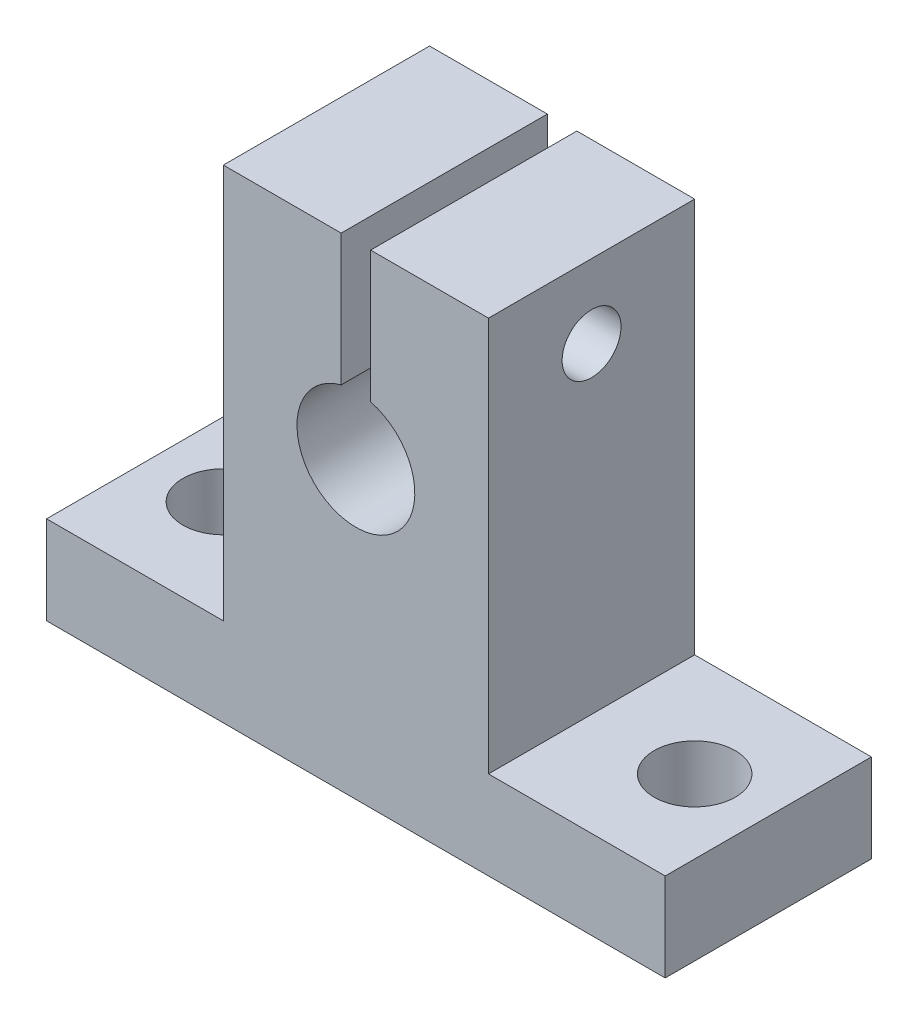
ISO-10303-21;
HEADER;
FILE_DESCRIPTION(('STEP AP214'),'2;1');
FILE_NAME('part.step','',(''),(''),'','','');
FILE_SCHEMA(('AUTOMOTIVE_DESIGN { 1 0 10303 214 1 1 1 1 }'));
ENDSEC;
DATA;
#1=APPLICATION_CONTEXT('core data for automotive mechanical design processes');
#2=APPLICATION_PROTOCOL_DEFINITION('international standard','automotive_design',2000,#1);
#3=PRODUCT_CONTEXT('',#1,'mechanical');
#4=PRODUCT('Part','Part','',(#3));
#5=PRODUCT_RELATED_PRODUCT_CATEGORY('part','',(#4));
#6=PRODUCT_DEFINITION_FORMATION('','',#4);
#7=PRODUCT_DEFINITION_CONTEXT('part definition',#1,'design');
#8=PRODUCT_DEFINITION('design','',#6,#7);
#9=PRODUCT_DEFINITION_SHAPE('','',#8);
#10=(LENGTH_UNIT() NAMED_UNIT(*) SI_UNIT(.MILLI.,.METRE.));
#11=(NAMED_UNIT(*) PLANE_ANGLE_UNIT() SI_UNIT($,.RADIAN.));
#12=(NAMED_UNIT(*) SI_UNIT($,.STERADIAN.) SOLID_ANGLE_UNIT());
#13=UNCERTAINTY_MEASURE_WITH_UNIT(LENGTH_MEASURE(1.E-05),#10,'distance_accuracy_value','');
#14=(GEOMETRIC_REPRESENTATION_CONTEXT(3) GLOBAL_UNCERTAINTY_ASSIGNED_CONTEXT((#13)) GLOBAL_UNIT_ASSIGNED_CONTEXT((#10,
#11,#12)) REPRESENTATION_CONTEXT('',''));
#15=CARTESIAN_POINT('',(0.,0.,0.));
#16=DIRECTION('',(0.,0.,1.));
#17=DIRECTION('',(1.,0.,0.));
#18=AXIS2_PLACEMENT_3D('',#15,#16,#17);
#19=CARTESIAN_POINT('',(14.6568542494924,27.8,7.));
#20=DIRECTION('',(-1.,0.,0.));
#21=DIRECTION('',(0.,0.,1.));
#22=AXIS2_PLACEMENT_3D('',#19,#20,#21);
#23=CYLINDRICAL_SURFACE('',#22,2.);
#24=CARTESIAN_POINT('',(-0.999999999999999,27.8,7.));
#25=DIRECTION('',(-1.,0.,0.));
#26=DIRECTION('',(0.,0.,1.));
#27=AXIS2_PLACEMENT_3D('',#24,#25,#26);
#28=CIRCLE('',#27,2.);
#29=CARTESIAN_POINT('',(-0.999999999999999,27.8,9.));
#30=VERTEX_POINT('',#29);
#31=EDGE_CURVE('E180',#30,#30,#28,.T.);
#32=ORIENTED_EDGE('',*,*,#31,.F.);
#33=EDGE_LOOP('',(#32));
#34=FACE_BOUND('',#33,.T.);
#35=CARTESIAN_POINT('',(-5.,27.8,7.));
#36=DIRECTION('',(-1.,0.,0.));
#37=DIRECTION('',(0.,0.,1.));
#38=AXIS2_PLACEMENT_3D('',#35,#36,#37);
#39=CIRCLE('',#38,2.);
#40=CARTESIAN_POINT('',(-5.,27.8,9.));
#41=VERTEX_POINT('',#40);
#42=EDGE_CURVE('E37',#41,#41,#39,.F.);
#43=ORIENTED_EDGE('',*,*,#42,.F.);
#44=EDGE_LOOP('',(#43));
#45=FACE_BOUND('',#44,.T.);
#46=ADVANCED_FACE('F33',(#34,#45),#23,.F.);
#47=CARTESIAN_POINT('',(-9.,32.8,14.));
#48=DIRECTION('',(0.,-1.,0.));
#49=DIRECTION('',(0.,0.,-1.));
#50=AXIS2_PLACEMENT_3D('',#47,#48,#49);
#51=PLANE('',#50);
#52=DIRECTION('',(0.,0.,-1.));
#53=VECTOR('',#52,1.);
#54=CARTESIAN_POINT('',(0.999999999999999,32.8,14.));
#55=LINE('',#54,#53);
#56=CARTESIAN_POINT('',(0.999999999999999,32.8,14.));
#57=VERTEX_POINT('',#56);
#58=CARTESIAN_POINT('',(0.999999999999999,32.8,0.));
#59=VERTEX_POINT('',#58);
#60=EDGE_CURVE('E215',#57,#59,#55,.T.);
#61=ORIENTED_EDGE('',*,*,#60,.F.);
#62=DIRECTION('',(-1.,0.,0.));
#63=VECTOR('',#62,1.);
#64=CARTESIAN_POINT('',(-9.,32.8,14.));
#65=LINE('',#64,#63);
#66=CARTESIAN_POINT('',(9.,32.8,14.));
#67=VERTEX_POINT('',#66);
#68=EDGE_CURVE('E130',#67,#57,#65,.T.);
#69=ORIENTED_EDGE('',*,*,#68,.F.);
#70=DIRECTION('',(0.,0.,-1.));
#71=VECTOR('',#70,1.);
#72=CARTESIAN_POINT('',(9.,32.8,14.));
#73=LINE('',#72,#71);
#74=CARTESIAN_POINT('',(9.,32.8,0.));
#75=VERTEX_POINT('',#74);
#76=EDGE_CURVE('E140',#67,#75,#73,.T.);
#77=ORIENTED_EDGE('',*,*,#76,.T.);
#78=DIRECTION('',(-1.,0.,0.));
#79=VECTOR('',#78,1.);
#80=CARTESIAN_POINT('',(-9.,32.8,0.));
#81=LINE('',#80,#79);
#82=EDGE_CURVE('E162',#75,#59,#81,.T.);
#83=ORIENTED_EDGE('',*,*,#82,.T.);
#84=EDGE_LOOP('',(#61,#69,#77,#83));
#85=FACE_BOUND('',#84,.T.);
#86=ADVANCED_FACE('F248',(#85),#51,.F.);
#87=CARTESIAN_POINT('',(0.,0.,14.));
#88=DIRECTION('',(0.,0.,-1.));
#89=DIRECTION('',(-1.,0.,0.));
#90=AXIS2_PLACEMENT_3D('',#87,#88,#89);
#91=PLANE('',#90);
#92=DIRECTION('',(0.,1.,0.));
#93=VECTOR('',#92,1.);
#94=CARTESIAN_POINT('',(0.999999999999999,23.8729833462074,14.));
#95=LINE('',#94,#93);
#96=CARTESIAN_POINT('',(0.999999999999999,23.8729833462074,14.));
#97=VERTEX_POINT('',#96);
#98=EDGE_CURVE('E218',#97,#57,#95,.T.);
#99=ORIENTED_EDGE('',*,*,#98,.F.);
#100=CARTESIAN_POINT('',(0.,20.,14.));
#101=DIRECTION('',(0.,0.,-1.));
#102=DIRECTION('',(-1.,0.,0.));
#103=AXIS2_PLACEMENT_3D('',#100,#101,#102);
#104=CIRCLE('',#103,4.);
#105=CARTESIAN_POINT('',(-0.999999999999999,23.8729833462074,14.));
#106=VERTEX_POINT('',#105);
#107=EDGE_CURVE('E211',#97,#106,#104,.T.);
#108=ORIENTED_EDGE('',*,*,#107,.T.);
#109=DIRECTION('',(0.,1.,0.));
#110=VECTOR('',#109,1.);
#111=CARTESIAN_POINT('',(-0.999999999999999,23.8729833462074,14.));
#112=LINE('',#111,#110);
#113=CARTESIAN_POINT('',(-0.999999999999999,32.8,14.));
#114=VERTEX_POINT('',#113);
#115=EDGE_CURVE('E127',#106,#114,#112,.T.);
#116=ORIENTED_EDGE('',*,*,#115,.T.);
#117=CARTESIAN_POINT('',(-9.,32.8,14.));
#118=VERTEX_POINT('',#117);
#119=EDGE_CURVE('E117',#114,#118,#65,.T.);
#120=ORIENTED_EDGE('',*,*,#119,.T.);
#121=DIRECTION('',(0.,-1.,0.));
#122=VECTOR('',#121,1.);
#123=CARTESIAN_POINT('',(-9.,6.,14.));
#124=LINE('',#123,#122);
#125=CARTESIAN_POINT('',(-9.,6.,14.));
#126=VERTEX_POINT('',#125);
#127=EDGE_CURVE('E122',#118,#126,#124,.T.);
#128=ORIENTED_EDGE('',*,*,#127,.T.);
#129=DIRECTION('',(-1.,0.,0.));
#130=VECTOR('',#129,1.);
#131=CARTESIAN_POINT('',(-21.,6.,14.));
#132=LINE('',#131,#130);
#133=CARTESIAN_POINT('',(-21.,6.,14.));
#134=VERTEX_POINT('',#133);
#135=EDGE_CURVE('E59',#126,#134,#132,.T.);
#136=ORIENTED_EDGE('',*,*,#135,.T.);
#137=DIRECTION('',(0.,-1.,0.));
#138=VECTOR('',#137,1.);
#139=CARTESIAN_POINT('',(-21.,0.,14.));
#140=LINE('',#139,#138);
#141=CARTESIAN_POINT('',(-21.,0.,14.));
#142=VERTEX_POINT('',#141);
#143=EDGE_CURVE('E168',#134,#142,#140,.T.);
#144=ORIENTED_EDGE('',*,*,#143,.T.);
#145=DIRECTION('',(1.,0.,0.));
#146=VECTOR('',#145,1.);
#147=CARTESIAN_POINT('',(21.,0.,14.));
#148=LINE('',#147,#146);
#149=CARTESIAN_POINT('',(21.,0.,14.));
#150=VERTEX_POINT('',#149);
#151=EDGE_CURVE('E100',#142,#150,#148,.T.);
#152=ORIENTED_EDGE('',*,*,#151,.T.);
#153=DIRECTION('',(0.,1.,0.));
#154=VECTOR('',#153,1.);
#155=CARTESIAN_POINT('',(21.,0.,14.));
#156=LINE('',#155,#154);
#157=CARTESIAN_POINT('',(21.,6.,14.));
#158=VERTEX_POINT('',#157);
#159=EDGE_CURVE('E233',#150,#158,#156,.T.);
#160=ORIENTED_EDGE('',*,*,#159,.T.);
#161=DIRECTION('',(-1.,0.,0.));
#162=VECTOR('',#161,1.);
#163=CARTESIAN_POINT('',(21.,6.,14.));
#164=LINE('',#163,#162);
#165=CARTESIAN_POINT('',(9.,6.,14.));
#166=VERTEX_POINT('',#165);
#167=EDGE_CURVE('E235',#158,#166,#164,.T.);
#168=ORIENTED_EDGE('',*,*,#167,.T.);
#169=DIRECTION('',(0.,1.,0.));
#170=VECTOR('',#169,1.);
#171=CARTESIAN_POINT('',(9.,6.,14.));
#172=LINE('',#171,#170);
#173=EDGE_CURVE('E131',#166,#67,#172,.T.);
#174=ORIENTED_EDGE('',*,*,#173,.T.);
#175=ORIENTED_EDGE('',*,*,#68,.T.);
#176=EDGE_LOOP('',(#99,#108,#116,#120,#128,#136,#144,#152,#160,#168,#174,#175));
#177=FACE_BOUND('',#176,.T.);
#178=ADVANCED_FACE('F120',(#177),#91,.F.);
#179=CARTESIAN_POINT('',(0.,0.,0.));
#180=DIRECTION('',(0.,0.,-1.));
#181=DIRECTION('',(-1.,0.,0.));
#182=AXIS2_PLACEMENT_3D('',#179,#180,#181);
#183=PLANE('',#182);
#184=CARTESIAN_POINT('',(0.,20.,0.));
#185=DIRECTION('',(0.,0.,-1.));
#186=DIRECTION('',(-1.,0.,0.));
#187=AXIS2_PLACEMENT_3D('',#184,#185,#186);
#188=CIRCLE('',#187,4.);
#189=CARTESIAN_POINT('',(0.999999999999999,23.8729833462074,0.));
#190=VERTEX_POINT('',#189);
#191=CARTESIAN_POINT('',(-0.999999999999999,23.8729833462074,0.));
#192=VERTEX_POINT('',#191);
#193=EDGE_CURVE('E50',#190,#192,#188,.T.);
#194=ORIENTED_EDGE('',*,*,#193,.F.);
#195=DIRECTION('',(0.,1.,0.));
#196=VECTOR('',#195,1.);
#197=CARTESIAN_POINT('',(0.999999999999999,23.8729833462074,0.));
#198=LINE('',#197,#196);
#199=EDGE_CURVE('E206',#190,#59,#198,.T.);
#200=ORIENTED_EDGE('',*,*,#199,.T.);
#201=ORIENTED_EDGE('',*,*,#82,.F.);
#202=DIRECTION('',(0.,1.,0.));
#203=VECTOR('',#202,1.);
#204=CARTESIAN_POINT('',(9.,6.,0.));
#205=LINE('',#204,#203);
#206=CARTESIAN_POINT('',(9.,6.,0.));
#207=VERTEX_POINT('',#206);
#208=EDGE_CURVE('E160',#207,#75,#205,.T.);
#209=ORIENTED_EDGE('',*,*,#208,.F.);
#210=DIRECTION('',(-1.,0.,0.));
#211=VECTOR('',#210,1.);
#212=CARTESIAN_POINT('',(21.,6.,0.));
#213=LINE('',#212,#211);
#214=CARTESIAN_POINT('',(21.,6.,0.));
#215=VERTEX_POINT('',#214);
#216=EDGE_CURVE('E158',#215,#207,#213,.T.);
#217=ORIENTED_EDGE('',*,*,#216,.F.);
#218=DIRECTION('',(0.,1.,0.));
#219=VECTOR('',#218,1.);
#220=CARTESIAN_POINT('',(21.,0.,0.));
#221=LINE('',#220,#219);
#222=CARTESIAN_POINT('',(21.,0.,0.));
#223=VERTEX_POINT('',#222);
#224=EDGE_CURVE('E156',#223,#215,#221,.T.);
#225=ORIENTED_EDGE('',*,*,#224,.F.);
#226=DIRECTION('',(1.,0.,0.));
#227=VECTOR('',#226,1.);
#228=CARTESIAN_POINT('',(21.,0.,0.));
#229=LINE('',#228,#227);
#230=CARTESIAN_POINT('',(-21.,0.,0.));
#231=VERTEX_POINT('',#230);
#232=EDGE_CURVE('E153',#231,#223,#229,.T.);
#233=ORIENTED_EDGE('',*,*,#232,.F.);
#234=DIRECTION('',(0.,-1.,0.));
#235=VECTOR('',#234,1.);
#236=CARTESIAN_POINT('',(-21.,0.,0.));
#237=LINE('',#236,#235);
#238=CARTESIAN_POINT('',(-21.,6.,0.));
#239=VERTEX_POINT('',#238);
#240=EDGE_CURVE('E150',#239,#231,#237,.T.);
#241=ORIENTED_EDGE('',*,*,#240,.F.);
#242=DIRECTION('',(-1.,0.,0.));
#243=VECTOR('',#242,1.);
#244=CARTESIAN_POINT('',(-21.,6.,0.));
#245=LINE('',#244,#243);
#246=CARTESIAN_POINT('',(-9.,6.,0.));
#247=VERTEX_POINT('',#246);
#248=EDGE_CURVE('E92',#247,#239,#245,.T.);
#249=ORIENTED_EDGE('',*,*,#248,.F.);
#250=DIRECTION('',(0.,-1.,0.));
#251=VECTOR('',#250,1.);
#252=CARTESIAN_POINT('',(-9.,6.,0.));
#253=LINE('',#252,#251);
#254=CARTESIAN_POINT('',(-9.,32.8,0.));
#255=VERTEX_POINT('',#254);
#256=EDGE_CURVE('E165',#255,#247,#253,.T.);
#257=ORIENTED_EDGE('',*,*,#256,.F.);
#258=CARTESIAN_POINT('',(-0.999999999999999,32.8,0.));
#259=VERTEX_POINT('',#258);
#260=EDGE_CURVE('E137',#259,#255,#81,.T.);
#261=ORIENTED_EDGE('',*,*,#260,.F.);
#262=DIRECTION('',(0.,1.,0.));
#263=VECTOR('',#262,1.);
#264=CARTESIAN_POINT('',(-0.999999999999999,23.8729833462074,0.));
#265=LINE('',#264,#263);
#266=EDGE_CURVE('E221',#192,#259,#265,.T.);
#267=ORIENTED_EDGE('',*,*,#266,.F.);
#268=EDGE_LOOP('',(#194,#200,#201,#209,#217,#225,#233,#241,#249,#257,#261,#267));
#269=FACE_BOUND('',#268,.T.);
#270=ADVANCED_FACE('F257',(#269),#183,.T.);
#271=CARTESIAN_POINT('',(-21.,0.,14.));
#272=DIRECTION('',(1.,0.,0.));
#273=DIRECTION('',(0.,0.,-1.));
#274=AXIS2_PLACEMENT_3D('',#271,#272,#273);
#275=PLANE('',#274);
#276=ORIENTED_EDGE('',*,*,#240,.T.);
#277=DIRECTION('',(0.,0.,-1.));
#278=VECTOR('',#277,1.);
#279=CARTESIAN_POINT('',(-21.,0.,14.));
#280=LINE('',#279,#278);
#281=EDGE_CURVE('E11',#142,#231,#280,.T.);
#282=ORIENTED_EDGE('',*,*,#281,.F.);
#283=ORIENTED_EDGE('',*,*,#143,.F.);
#284=DIRECTION('',(0.,0.,-1.));
#285=VECTOR('',#284,1.);
#286=CARTESIAN_POINT('',(-21.,6.,14.));
#287=LINE('',#286,#285);
#288=EDGE_CURVE('E145',#134,#239,#287,.T.);
#289=ORIENTED_EDGE('',*,*,#288,.T.);
#290=EDGE_LOOP('',(#276,#282,#283,#289));
#291=FACE_BOUND('',#290,.T.);
#292=ADVANCED_FACE('F35',(#291),#275,.F.);
#293=CARTESIAN_POINT('',(21.,0.,14.));
#294=DIRECTION('',(0.,1.,0.));
#295=DIRECTION('',(0.,0.,1.));
#296=AXIS2_PLACEMENT_3D('',#293,#294,#295);
#297=PLANE('',#296);
#298=CARTESIAN_POINT('',(16.,0.,7.));
#299=DIRECTION('',(0.,-1.,0.));
#300=DIRECTION('',(0.,0.,-1.));
#301=AXIS2_PLACEMENT_3D('',#298,#299,#300);
#302=CIRCLE('',#301,2.75);
#303=CARTESIAN_POINT('',(16.,0.,4.25));
#304=VERTEX_POINT('',#303);
#305=EDGE_CURVE('E199',#304,#304,#302,.T.);
#306=ORIENTED_EDGE('',*,*,#305,.F.);
#307=EDGE_LOOP('',(#306));
#308=FACE_BOUND('',#307,.T.);
#309=CARTESIAN_POINT('',(-16.,0.,6.99999999999998));
#310=DIRECTION('',(0.,-1.,0.));
#311=DIRECTION('',(0.,0.,1.));
#312=AXIS2_PLACEMENT_3D('',#309,#310,#311);
#313=CIRCLE('',#312,2.75);
#314=CARTESIAN_POINT('',(-16.,0.,9.74999999999998));
#315=VERTEX_POINT('',#314);
#316=EDGE_CURVE('E187',#315,#315,#313,.T.);
#317=ORIENTED_EDGE('',*,*,#316,.F.);
#318=EDGE_LOOP('',(#317));
#319=FACE_BOUND('',#318,.T.);
#320=ORIENTED_EDGE('',*,*,#232,.T.);
#321=DIRECTION('',(0.,0.,-1.));
#322=VECTOR('',#321,1.);
#323=CARTESIAN_POINT('',(21.,0.,14.));
#324=LINE('',#323,#322);
#325=EDGE_CURVE('E42',#150,#223,#324,.T.);
#326=ORIENTED_EDGE('',*,*,#325,.F.);
#327=ORIENTED_EDGE('',*,*,#151,.F.);
#328=ORIENTED_EDGE('',*,*,#281,.T.);
#329=EDGE_LOOP('',(#320,#326,#327,#328));
#330=FACE_BOUND('',#329,.T.);
#331=ADVANCED_FACE('F276',(#308,#319,#330),#297,.F.);
#332=CARTESIAN_POINT('',(21.,0.,14.));
#333=DIRECTION('',(-1.,0.,0.));
#334=DIRECTION('',(0.,0.,1.));
#335=AXIS2_PLACEMENT_3D('',#332,#333,#334);
#336=PLANE('',#335);
#337=ORIENTED_EDGE('',*,*,#224,.T.);
#338=DIRECTION('',(0.,0.,-1.));
#339=VECTOR('',#338,1.);
#340=CARTESIAN_POINT('',(21.,6.,14.));
#341=LINE('',#340,#339);
#342=EDGE_CURVE('E176',#158,#215,#341,.T.);
#343=ORIENTED_EDGE('',*,*,#342,.F.);
#344=ORIENTED_EDGE('',*,*,#159,.F.);
#345=ORIENTED_EDGE('',*,*,#325,.T.);
#346=EDGE_LOOP('',(#337,#343,#344,#345));
#347=FACE_BOUND('',#346,.T.);
#348=ADVANCED_FACE('F279',(#347),#336,.F.);
#349=CARTESIAN_POINT('',(21.,6.,14.));
#350=DIRECTION('',(0.,-1.,0.));
#351=DIRECTION('',(0.,0.,-1.));
#352=AXIS2_PLACEMENT_3D('',#349,#350,#351);
#353=PLANE('',#352);
#354=CARTESIAN_POINT('',(16.,6.,7.));
#355=DIRECTION('',(0.,-1.,0.));
#356=DIRECTION('',(0.,0.,-1.));
#357=AXIS2_PLACEMENT_3D('',#354,#355,#356);
#358=CIRCLE('',#357,2.75);
#359=CARTESIAN_POINT('',(16.,6.,4.25));
#360=VERTEX_POINT('',#359);
#361=EDGE_CURVE('E202',#360,#360,#358,.F.);
#362=ORIENTED_EDGE('',*,*,#361,.F.);
#363=EDGE_LOOP('',(#362));
#364=FACE_BOUND('',#363,.T.);
#365=ORIENTED_EDGE('',*,*,#216,.T.);
#366=DIRECTION('',(0.,0.,-1.));
#367=VECTOR('',#366,1.);
#368=CARTESIAN_POINT('',(9.,6.,14.));
#369=LINE('',#368,#367);
#370=EDGE_CURVE('E173',#166,#207,#369,.T.);
#371=ORIENTED_EDGE('',*,*,#370,.F.);
#372=ORIENTED_EDGE('',*,*,#167,.F.);
#373=ORIENTED_EDGE('',*,*,#342,.T.);
#374=EDGE_LOOP('',(#365,#371,#372,#373));
#375=FACE_BOUND('',#374,.T.);
#376=ADVANCED_FACE('F282',(#364,#375),#353,.F.);
#377=CARTESIAN_POINT('',(9.,6.,14.));
#378=DIRECTION('',(-1.,0.,0.));
#379=DIRECTION('',(0.,0.,1.));
#380=AXIS2_PLACEMENT_3D('',#377,#378,#379);
#381=PLANE('',#380);
#382=CARTESIAN_POINT('',(9.,27.8,7.));
#383=DIRECTION('',(-1.,0.,0.));
#384=DIRECTION('',(0.,0.,1.));
#385=AXIS2_PLACEMENT_3D('',#382,#383,#384);
#386=CIRCLE('',#385,2.);
#387=CARTESIAN_POINT('',(9.,27.8,9.));
#388=VERTEX_POINT('',#387);
#389=EDGE_CURVE('E183',#388,#388,#386,.F.);
#390=ORIENTED_EDGE('',*,*,#389,.F.);
#391=EDGE_LOOP('',(#390));
#392=FACE_BOUND('',#391,.T.);
#393=ORIENTED_EDGE('',*,*,#208,.T.);
#394=ORIENTED_EDGE('',*,*,#76,.F.);
#395=ORIENTED_EDGE('',*,*,#173,.F.);
#396=ORIENTED_EDGE('',*,*,#370,.T.);
#397=EDGE_LOOP('',(#393,#394,#395,#396));
#398=FACE_BOUND('',#397,.T.);
#399=ADVANCED_FACE('F243',(#392,#398),#381,.F.);
#400=ORIENTED_EDGE('',*,*,#119,.F.);
#401=DIRECTION('',(0.,0.,-1.));
#402=VECTOR('',#401,1.);
#403=CARTESIAN_POINT('',(-0.999999999999999,32.8,14.));
#404=LINE('',#403,#402);
#405=EDGE_CURVE('E223',#114,#259,#404,.T.);
#406=ORIENTED_EDGE('',*,*,#405,.T.);
#407=ORIENTED_EDGE('',*,*,#260,.T.);
#408=DIRECTION('',(0.,0.,-1.));
#409=VECTOR('',#408,1.);
#410=CARTESIAN_POINT('',(-9.,32.8,14.));
#411=LINE('',#410,#409);
#412=EDGE_CURVE('E134',#118,#255,#411,.T.);
#413=ORIENTED_EDGE('',*,*,#412,.F.);
#414=EDGE_LOOP('',(#400,#406,#407,#413));
#415=FACE_BOUND('',#414,.T.);
#416=ADVANCED_FACE('F135',(#415),#51,.F.);
#417=CARTESIAN_POINT('',(-9.,6.,14.));
#418=DIRECTION('',(1.,0.,0.));
#419=DIRECTION('',(0.,0.,-1.));
#420=AXIS2_PLACEMENT_3D('',#417,#418,#419);
#421=PLANE('',#420);
#422=CARTESIAN_POINT('',(-9.,27.8,7.));
#423=DIRECTION('',(-1.,0.,0.));
#424=DIRECTION('',(0.,0.,1.));
#425=AXIS2_PLACEMENT_3D('',#422,#423,#424);
#426=CIRCLE('',#425,3.5);
#427=CARTESIAN_POINT('',(-9.,27.8,10.5));
#428=VERTEX_POINT('',#427);
#429=EDGE_CURVE('E196',#428,#428,#426,.T.);
#430=ORIENTED_EDGE('',*,*,#429,.F.);
#431=EDGE_LOOP('',(#430));
#432=FACE_BOUND('',#431,.T.);
#433=ORIENTED_EDGE('',*,*,#256,.T.);
#434=DIRECTION('',(0.,0.,-1.));
#435=VECTOR('',#434,1.);
#436=CARTESIAN_POINT('',(-9.,6.,14.));
#437=LINE('',#436,#435);
#438=EDGE_CURVE('E141',#126,#247,#437,.T.);
#439=ORIENTED_EDGE('',*,*,#438,.F.);
#440=ORIENTED_EDGE('',*,*,#127,.F.);
#441=ORIENTED_EDGE('',*,*,#412,.T.);
#442=EDGE_LOOP('',(#433,#439,#440,#441));
#443=FACE_BOUND('',#442,.T.);
#444=ADVANCED_FACE('F143',(#432,#443),#421,.F.);
#445=CARTESIAN_POINT('',(-21.,6.,14.));
#446=DIRECTION('',(0.,-1.,0.));
#447=DIRECTION('',(0.,0.,-1.));
#448=AXIS2_PLACEMENT_3D('',#445,#446,#447);
#449=PLANE('',#448);
#450=CARTESIAN_POINT('',(-16.,6.,6.99999999999998));
#451=DIRECTION('',(0.,-1.,0.));
#452=DIRECTION('',(0.,0.,-1.));
#453=AXIS2_PLACEMENT_3D('',#450,#451,#452);
#454=CIRCLE('',#453,2.75);
#455=CARTESIAN_POINT('',(-16.,6.,4.24999999999999));
#456=VERTEX_POINT('',#455);
#457=EDGE_CURVE('E203',#456,#456,#454,.F.);
#458=ORIENTED_EDGE('',*,*,#457,.F.);
#459=EDGE_LOOP('',(#458));
#460=FACE_BOUND('',#459,.T.);
#461=ORIENTED_EDGE('',*,*,#248,.T.);
#462=ORIENTED_EDGE('',*,*,#288,.F.);
#463=ORIENTED_EDGE('',*,*,#135,.F.);
#464=ORIENTED_EDGE('',*,*,#438,.T.);
#465=EDGE_LOOP('',(#461,#462,#463,#464));
#466=FACE_BOUND('',#465,.T.);
#467=ADVANCED_FACE('F270',(#460,#466),#449,.F.);
#468=CARTESIAN_POINT('',(0.,20.,14.));
#469=DIRECTION('',(0.,0.,-1.));
#470=DIRECTION('',(-1.,0.,0.));
#471=AXIS2_PLACEMENT_3D('',#468,#469,#470);
#472=CYLINDRICAL_SURFACE('',#471,4.);
#473=ORIENTED_EDGE('',*,*,#193,.T.);
#474=DIRECTION('',(0.,0.,-1.));
#475=VECTOR('',#474,1.);
#476=CARTESIAN_POINT('',(-0.999999999999999,23.8729833462074,14.));
#477=LINE('',#476,#475);
#478=EDGE_CURVE('E213',#106,#192,#477,.T.);
#479=ORIENTED_EDGE('',*,*,#478,.F.);
#480=ORIENTED_EDGE('',*,*,#107,.F.);
#481=DIRECTION('',(0.,0.,-1.));
#482=VECTOR('',#481,1.);
#483=CARTESIAN_POINT('',(0.999999999999999,23.8729833462074,14.));
#484=LINE('',#483,#482);
#485=EDGE_CURVE('E154',#97,#190,#484,.T.);
#486=ORIENTED_EDGE('',*,*,#485,.T.);
#487=EDGE_LOOP('',(#473,#479,#480,#486));
#488=FACE_BOUND('',#487,.T.);
#489=ADVANCED_FACE('F266',(#488),#472,.F.);
#490=CARTESIAN_POINT('',(0.999999999999999,23.8729833462074,14.));
#491=DIRECTION('',(-1.,0.,0.));
#492=DIRECTION('',(0.,0.,1.));
#493=AXIS2_PLACEMENT_3D('',#490,#491,#492);
#494=PLANE('',#493);
#495=CARTESIAN_POINT('',(0.999999999999999,27.8,7.));
#496=DIRECTION('',(-1.,0.,0.));
#497=DIRECTION('',(0.,0.,1.));
#498=AXIS2_PLACEMENT_3D('',#495,#496,#497);
#499=CIRCLE('',#498,2.);
#500=CARTESIAN_POINT('',(0.999999999999999,27.8,9.));
#501=VERTEX_POINT('',#500);
#502=EDGE_CURVE('E182',#501,#501,#499,.T.);
#503=ORIENTED_EDGE('',*,*,#502,.F.);
#504=EDGE_LOOP('',(#503));
#505=FACE_BOUND('',#504,.T.);
#506=ORIENTED_EDGE('',*,*,#199,.F.);
#507=ORIENTED_EDGE('',*,*,#485,.F.);
#508=ORIENTED_EDGE('',*,*,#98,.T.);
#509=ORIENTED_EDGE('',*,*,#60,.T.);
#510=EDGE_LOOP('',(#506,#507,#508,#509));
#511=FACE_BOUND('',#510,.T.);
#512=ADVANCED_FACE('F253',(#505,#511),#494,.T.);
#513=CARTESIAN_POINT('',(-0.999999999999999,23.8729833462074,14.));
#514=DIRECTION('',(-1.,0.,0.));
#515=DIRECTION('',(0.,0.,1.));
#516=AXIS2_PLACEMENT_3D('',#513,#514,#515);
#517=PLANE('',#516);
#518=ORIENTED_EDGE('',*,*,#31,.T.);
#519=EDGE_LOOP('',(#518));
#520=FACE_BOUND('',#519,.T.);
#521=ORIENTED_EDGE('',*,*,#266,.T.);
#522=ORIENTED_EDGE('',*,*,#405,.F.);
#523=ORIENTED_EDGE('',*,*,#115,.F.);
#524=ORIENTED_EDGE('',*,*,#478,.T.);
#525=EDGE_LOOP('',(#521,#522,#523,#524));
#526=FACE_BOUND('',#525,.T.);
#527=ADVANCED_FACE('F268',(#520,#526),#517,.F.);
#528=CARTESIAN_POINT('',(-16.,32.801,6.99999999999998));
#529=DIRECTION('',(0.,-1.,0.));
#530=DIRECTION('',(0.,0.,-1.));
#531=AXIS2_PLACEMENT_3D('',#528,#529,#530);
#532=CYLINDRICAL_SURFACE('',#531,2.75);
#533=ORIENTED_EDGE('',*,*,#316,.T.);
#534=EDGE_LOOP('',(#533));
#535=FACE_BOUND('',#534,.T.);
#536=ORIENTED_EDGE('',*,*,#457,.T.);
#537=EDGE_LOOP('',(#536));
#538=FACE_BOUND('',#537,.T.);
#539=ADVANCED_FACE('F316',(#535,#538),#532,.F.);
#540=CARTESIAN_POINT('',(16.,32.801,7.));
#541=DIRECTION('',(0.,-1.,0.));
#542=DIRECTION('',(0.,0.,-1.));
#543=AXIS2_PLACEMENT_3D('',#540,#541,#542);
#544=CYLINDRICAL_SURFACE('',#543,2.75);
#545=ORIENTED_EDGE('',*,*,#305,.T.);
#546=EDGE_LOOP('',(#545));
#547=FACE_BOUND('',#546,.T.);
#548=ORIENTED_EDGE('',*,*,#361,.T.);
#549=EDGE_LOOP('',(#548));
#550=FACE_BOUND('',#549,.T.);
#551=ADVANCED_FACE('F307',(#547,#550),#544,.F.);
#552=ORIENTED_EDGE('',*,*,#502,.T.);
#553=EDGE_LOOP('',(#552));
#554=FACE_BOUND('',#553,.T.);
#555=ORIENTED_EDGE('',*,*,#389,.T.);
#556=EDGE_LOOP('',(#555));
#557=FACE_BOUND('',#556,.T.);
#558=ADVANCED_FACE('F297',(#554,#557),#23,.F.);
#559=CARTESIAN_POINT('',(-5.,27.8,7.));
#560=DIRECTION('',(-1.,0.,0.));
#561=DIRECTION('',(0.,0.,1.));
#562=AXIS2_PLACEMENT_3D('',#559,#560,#561);
#563=PLANE('',#562);
#564=CARTESIAN_POINT('',(-5.,27.8,7.));
#565=DIRECTION('',(-1.,0.,0.));
#566=DIRECTION('',(0.,0.,1.));
#567=AXIS2_PLACEMENT_3D('',#564,#565,#566);
#568=CIRCLE('',#567,3.5);
#569=CARTESIAN_POINT('',(-5.,27.8,10.5));
#570=VERTEX_POINT('',#569);
#571=EDGE_CURVE('E194',#570,#570,#568,.T.);
#572=ORIENTED_EDGE('',*,*,#571,.T.);
#573=EDGE_LOOP('',(#572));
#574=FACE_BOUND('',#573,.T.);
#575=ORIENTED_EDGE('',*,*,#42,.T.);
#576=EDGE_LOOP('',(#575));
#577=FACE_BOUND('',#576,.T.);
#578=ADVANCED_FACE('F306',(#574,#577),#563,.T.);
#579=CARTESIAN_POINT('',(-5.,27.8,7.));
#580=DIRECTION('',(-1.,0.,0.));
#581=DIRECTION('',(0.,0.,1.));
#582=AXIS2_PLACEMENT_3D('',#579,#580,#581);
#583=CYLINDRICAL_SURFACE('',#582,3.5);
#584=ORIENTED_EDGE('',*,*,#571,.F.);
#585=EDGE_LOOP('',(#584));
#586=FACE_BOUND('',#585,.T.);
#587=ORIENTED_EDGE('',*,*,#429,.T.);
#588=EDGE_LOOP('',(#587));
#589=FACE_BOUND('',#588,.T.);
#590=ADVANCED_FACE('F313',(#586,#589),#583,.F.);
#591=CLOSED_SHELL('',(#46,#86,#178,#270,#292,#331,#348,#376,#399,#416,#444,#467,#489,#512,#527,
#539,#551,#558,#578,#590));
#592=MANIFOLD_SOLID_BREP('B2',#591);
#593=ADVANCED_BREP_SHAPE_REPRESENTATION('',(#18,#592),#14);
#594=SHAPE_DEFINITION_REPRESENTATION(#9,#593);
ENDSEC;
END-ISO-10303-21;
